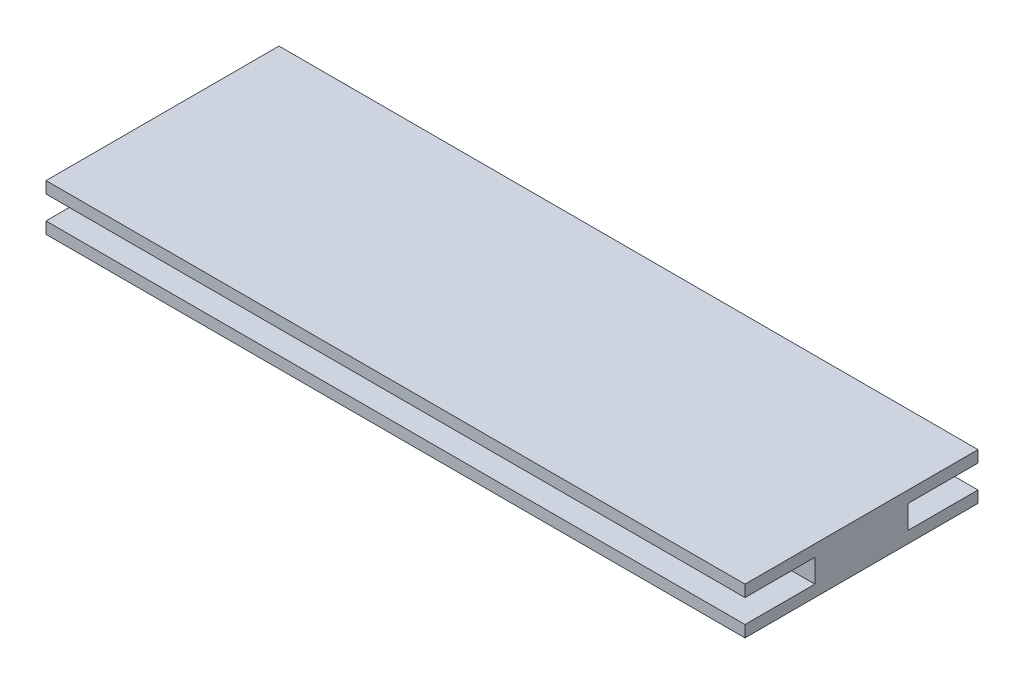
ISO-10303-21;
HEADER;
FILE_DESCRIPTION(('STEP AP214'),'2;1');
FILE_NAME('part.step','',(''),(''),'','','');
FILE_SCHEMA(('AUTOMOTIVE_DESIGN { 1 0 10303 214 1 1 1 1 }'));
ENDSEC;
DATA;
#1=APPLICATION_CONTEXT('core data for automotive mechanical design processes');
#2=APPLICATION_PROTOCOL_DEFINITION('international standard','automotive_design',2000,#1);
#3=PRODUCT_CONTEXT('',#1,'mechanical');
#4=PRODUCT('Part','Part','',(#3));
#5=PRODUCT_RELATED_PRODUCT_CATEGORY('part','',(#4));
#6=PRODUCT_DEFINITION_FORMATION('','',#4);
#7=PRODUCT_DEFINITION_CONTEXT('part definition',#1,'design');
#8=PRODUCT_DEFINITION('design','',#6,#7);
#9=PRODUCT_DEFINITION_SHAPE('','',#8);
#10=(LENGTH_UNIT() NAMED_UNIT(*) SI_UNIT(.MILLI.,.METRE.));
#11=(NAMED_UNIT(*) PLANE_ANGLE_UNIT() SI_UNIT($,.RADIAN.));
#12=(NAMED_UNIT(*) SI_UNIT($,.STERADIAN.) SOLID_ANGLE_UNIT());
#13=UNCERTAINTY_MEASURE_WITH_UNIT(LENGTH_MEASURE(1.E-05),#10,'distance_accuracy_value','');
#14=(GEOMETRIC_REPRESENTATION_CONTEXT(3) GLOBAL_UNCERTAINTY_ASSIGNED_CONTEXT((#13)) GLOBAL_UNIT_ASSIGNED_CONTEXT((#10,
#11,#12)) REPRESENTATION_CONTEXT('',''));
#15=CARTESIAN_POINT('',(0.,0.,0.));
#16=DIRECTION('',(0.,0.,1.));
#17=DIRECTION('',(1.,0.,0.));
#18=AXIS2_PLACEMENT_3D('',#15,#16,#17);
#19=CARTESIAN_POINT('',(95.25,1.5875,-15.875));
#20=DIRECTION('',(0.,0.,1.));
#21=DIRECTION('',(1.,0.,0.));
#22=AXIS2_PLACEMENT_3D('',#19,#20,#21);
#23=PLANE('',#22);
#24=DIRECTION('',(0.,1.,0.));
#25=VECTOR('',#24,1.);
#26=CARTESIAN_POINT('',(0.,1.5875,-15.875));
#27=LINE('',#26,#25);
#28=CARTESIAN_POINT('',(0.,1.5875,-15.875));
#29=VERTEX_POINT('',#28);
#30=CARTESIAN_POINT('',(0.,3.175,-15.875));
#31=VERTEX_POINT('',#30);
#32=EDGE_CURVE('E170',#29,#31,#27,.T.);
#33=ORIENTED_EDGE('',*,*,#32,.T.);
#34=DIRECTION('',(-1.,0.,0.));
#35=VECTOR('',#34,1.);
#36=CARTESIAN_POINT('',(95.25,3.175,-15.875));
#37=LINE('',#36,#35);
#38=CARTESIAN_POINT('',(95.25,3.175,-15.875));
#39=VERTEX_POINT('',#38);
#40=EDGE_CURVE('E11',#39,#31,#37,.T.);
#41=ORIENTED_EDGE('',*,*,#40,.F.);
#42=DIRECTION('',(0.,1.,0.));
#43=VECTOR('',#42,1.);
#44=CARTESIAN_POINT('',(95.25,1.5875,-15.875));
#45=LINE('',#44,#43);
#46=CARTESIAN_POINT('',(95.25,1.5875,-15.875));
#47=VERTEX_POINT('',#46);
#48=EDGE_CURVE('E204',#47,#39,#45,.T.);
#49=ORIENTED_EDGE('',*,*,#48,.F.);
#50=DIRECTION('',(-1.,0.,0.));
#51=VECTOR('',#50,1.);
#52=CARTESIAN_POINT('',(95.25,1.5875,-15.875));
#53=LINE('',#52,#51);
#54=EDGE_CURVE('E166',#47,#29,#53,.T.);
#55=ORIENTED_EDGE('',*,*,#54,.T.);
#56=EDGE_LOOP('',(#33,#41,#49,#55));
#57=FACE_BOUND('',#56,.T.);
#58=ADVANCED_FACE('F45',(#57),#23,.F.);
#59=CARTESIAN_POINT('',(95.25,3.175,15.875));
#60=DIRECTION('',(0.,-1.,0.));
#61=DIRECTION('',(0.,0.,-1.));
#62=AXIS2_PLACEMENT_3D('',#59,#60,#61);
#63=PLANE('',#62);
#64=DIRECTION('',(0.,0.,1.));
#65=VECTOR('',#64,1.);
#66=CARTESIAN_POINT('',(0.,3.175,15.875));
#67=LINE('',#66,#65);
#68=CARTESIAN_POINT('',(0.,3.175,15.875));
#69=VERTEX_POINT('',#68);
#70=EDGE_CURVE('E174',#31,#69,#67,.T.);
#71=ORIENTED_EDGE('',*,*,#70,.T.);
#72=DIRECTION('',(-1.,0.,0.));
#73=VECTOR('',#72,1.);
#74=CARTESIAN_POINT('',(95.25,3.175,15.875));
#75=LINE('',#74,#73);
#76=CARTESIAN_POINT('',(95.25,3.175,15.875));
#77=VERTEX_POINT('',#76);
#78=EDGE_CURVE('E54',#77,#69,#75,.T.);
#79=ORIENTED_EDGE('',*,*,#78,.F.);
#80=DIRECTION('',(0.,0.,1.));
#81=VECTOR('',#80,1.);
#82=CARTESIAN_POINT('',(95.25,3.175,15.875));
#83=LINE('',#82,#81);
#84=EDGE_CURVE('E117',#39,#77,#83,.T.);
#85=ORIENTED_EDGE('',*,*,#84,.F.);
#86=ORIENTED_EDGE('',*,*,#40,.T.);
#87=EDGE_LOOP('',(#71,#79,#85,#86));
#88=FACE_BOUND('',#87,.T.);
#89=ADVANCED_FACE('F298',(#88),#63,.F.);
#90=CARTESIAN_POINT('',(95.25,1.5875,15.875));
#91=DIRECTION('',(0.,0.,-1.));
#92=DIRECTION('',(-1.,0.,0.));
#93=AXIS2_PLACEMENT_3D('',#90,#91,#92);
#94=PLANE('',#93);
#95=DIRECTION('',(0.,-1.,0.));
#96=VECTOR('',#95,1.);
#97=CARTESIAN_POINT('',(0.,1.5875,15.875));
#98=LINE('',#97,#96);
#99=CARTESIAN_POINT('',(0.,1.5875,15.875));
#100=VERTEX_POINT('',#99);
#101=EDGE_CURVE('E177',#69,#100,#98,.T.);
#102=ORIENTED_EDGE('',*,*,#101,.T.);
#103=DIRECTION('',(-1.,0.,0.));
#104=VECTOR('',#103,1.);
#105=CARTESIAN_POINT('',(95.25,1.5875,15.875));
#106=LINE('',#105,#104);
#107=CARTESIAN_POINT('',(95.25,1.5875,15.875));
#108=VERTEX_POINT('',#107);
#109=EDGE_CURVE('E231',#108,#100,#106,.T.);
#110=ORIENTED_EDGE('',*,*,#109,.F.);
#111=DIRECTION('',(0.,-1.,0.));
#112=VECTOR('',#111,1.);
#113=CARTESIAN_POINT('',(95.25,1.5875,15.875));
#114=LINE('',#113,#112);
#115=EDGE_CURVE('E241',#77,#108,#114,.T.);
#116=ORIENTED_EDGE('',*,*,#115,.F.);
#117=ORIENTED_EDGE('',*,*,#78,.T.);
#118=EDGE_LOOP('',(#102,#110,#116,#117));
#119=FACE_BOUND('',#118,.T.);
#120=ADVANCED_FACE('F239',(#119),#94,.F.);
#121=CARTESIAN_POINT('',(95.25,1.5875,6.35));
#122=DIRECTION('',(0.,1.,0.));
#123=DIRECTION('',(0.,0.,1.));
#124=AXIS2_PLACEMENT_3D('',#121,#122,#123);
#125=PLANE('',#124);
#126=DIRECTION('',(0.,0.,-1.));
#127=VECTOR('',#126,1.);
#128=CARTESIAN_POINT('',(0.,1.5875,6.35));
#129=LINE('',#128,#127);
#130=CARTESIAN_POINT('',(0.,1.5875,6.35));
#131=VERTEX_POINT('',#130);
#132=EDGE_CURVE('E180',#100,#131,#129,.T.);
#133=ORIENTED_EDGE('',*,*,#132,.T.);
#134=DIRECTION('',(-1.,0.,0.));
#135=VECTOR('',#134,1.);
#136=CARTESIAN_POINT('',(95.25,1.5875,6.35));
#137=LINE('',#136,#135);
#138=CARTESIAN_POINT('',(95.25,1.5875,6.35));
#139=VERTEX_POINT('',#138);
#140=EDGE_CURVE('E227',#139,#131,#137,.T.);
#141=ORIENTED_EDGE('',*,*,#140,.F.);
#142=DIRECTION('',(0.,0.,-1.));
#143=VECTOR('',#142,1.);
#144=CARTESIAN_POINT('',(95.25,1.5875,6.35));
#145=LINE('',#144,#143);
#146=EDGE_CURVE('E260',#108,#139,#145,.T.);
#147=ORIENTED_EDGE('',*,*,#146,.F.);
#148=ORIENTED_EDGE('',*,*,#109,.T.);
#149=EDGE_LOOP('',(#133,#141,#147,#148));
#150=FACE_BOUND('',#149,.T.);
#151=ADVANCED_FACE('F250',(#150),#125,.F.);
#152=CARTESIAN_POINT('',(95.25,-1.5875,6.35));
#153=DIRECTION('',(0.,0.,-1.));
#154=DIRECTION('',(-1.,0.,0.));
#155=AXIS2_PLACEMENT_3D('',#152,#153,#154);
#156=PLANE('',#155);
#157=DIRECTION('',(0.,-1.,0.));
#158=VECTOR('',#157,1.);
#159=CARTESIAN_POINT('',(0.,-1.5875,6.35));
#160=LINE('',#159,#158);
#161=CARTESIAN_POINT('',(0.,-1.5875,6.35));
#162=VERTEX_POINT('',#161);
#163=EDGE_CURVE('E183',#131,#162,#160,.T.);
#164=ORIENTED_EDGE('',*,*,#163,.T.);
#165=DIRECTION('',(-1.,0.,0.));
#166=VECTOR('',#165,1.);
#167=CARTESIAN_POINT('',(95.25,-1.5875,6.35));
#168=LINE('',#167,#166);
#169=CARTESIAN_POINT('',(95.25,-1.5875,6.35));
#170=VERTEX_POINT('',#169);
#171=EDGE_CURVE('E223',#170,#162,#168,.T.);
#172=ORIENTED_EDGE('',*,*,#171,.F.);
#173=DIRECTION('',(0.,-1.,0.));
#174=VECTOR('',#173,1.);
#175=CARTESIAN_POINT('',(95.25,-1.5875,6.35));
#176=LINE('',#175,#174);
#177=EDGE_CURVE('E256',#139,#170,#176,.T.);
#178=ORIENTED_EDGE('',*,*,#177,.F.);
#179=ORIENTED_EDGE('',*,*,#140,.T.);
#180=EDGE_LOOP('',(#164,#172,#178,#179));
#181=FACE_BOUND('',#180,.T.);
#182=ADVANCED_FACE('F254',(#181),#156,.F.);
#183=CARTESIAN_POINT('',(95.25,-1.5875,6.35));
#184=DIRECTION('',(0.,-1.,0.));
#185=DIRECTION('',(0.,0.,-1.));
#186=AXIS2_PLACEMENT_3D('',#183,#184,#185);
#187=PLANE('',#186);
#188=DIRECTION('',(0.,0.,1.));
#189=VECTOR('',#188,1.);
#190=CARTESIAN_POINT('',(0.,-1.5875,6.35));
#191=LINE('',#190,#189);
#192=CARTESIAN_POINT('',(0.,-1.5875,15.875));
#193=VERTEX_POINT('',#192);
#194=EDGE_CURVE('E186',#162,#193,#191,.T.);
#195=ORIENTED_EDGE('',*,*,#194,.T.);
#196=DIRECTION('',(-1.,0.,0.));
#197=VECTOR('',#196,1.);
#198=CARTESIAN_POINT('',(95.25,-1.5875,15.875));
#199=LINE('',#198,#197);
#200=CARTESIAN_POINT('',(95.25,-1.5875,15.875));
#201=VERTEX_POINT('',#200);
#202=EDGE_CURVE('E219',#201,#193,#199,.T.);
#203=ORIENTED_EDGE('',*,*,#202,.F.);
#204=DIRECTION('',(0.,0.,1.));
#205=VECTOR('',#204,1.);
#206=CARTESIAN_POINT('',(95.25,-1.5875,6.35));
#207=LINE('',#206,#205);
#208=EDGE_CURVE('E259',#170,#201,#207,.T.);
#209=ORIENTED_EDGE('',*,*,#208,.F.);
#210=ORIENTED_EDGE('',*,*,#171,.T.);
#211=EDGE_LOOP('',(#195,#203,#209,#210));
#212=FACE_BOUND('',#211,.T.);
#213=ADVANCED_FACE('F311',(#212),#187,.F.);
#214=CARTESIAN_POINT('',(95.25,-3.175,15.875));
#215=DIRECTION('',(0.,0.,-1.));
#216=DIRECTION('',(-1.,0.,0.));
#217=AXIS2_PLACEMENT_3D('',#214,#215,#216);
#218=PLANE('',#217);
#219=DIRECTION('',(0.,-1.,0.));
#220=VECTOR('',#219,1.);
#221=CARTESIAN_POINT('',(0.,-3.175,15.875));
#222=LINE('',#221,#220);
#223=CARTESIAN_POINT('',(0.,-3.175,15.875));
#224=VERTEX_POINT('',#223);
#225=EDGE_CURVE('E189',#193,#224,#222,.T.);
#226=ORIENTED_EDGE('',*,*,#225,.T.);
#227=DIRECTION('',(-1.,0.,0.));
#228=VECTOR('',#227,1.);
#229=CARTESIAN_POINT('',(95.25,-3.175,15.875));
#230=LINE('',#229,#228);
#231=CARTESIAN_POINT('',(95.25,-3.175,15.875));
#232=VERTEX_POINT('',#231);
#233=EDGE_CURVE('E215',#232,#224,#230,.T.);
#234=ORIENTED_EDGE('',*,*,#233,.F.);
#235=DIRECTION('',(0.,-1.,0.));
#236=VECTOR('',#235,1.);
#237=CARTESIAN_POINT('',(95.25,-3.175,15.875));
#238=LINE('',#237,#236);
#239=EDGE_CURVE('E264',#201,#232,#238,.T.);
#240=ORIENTED_EDGE('',*,*,#239,.F.);
#241=ORIENTED_EDGE('',*,*,#202,.T.);
#242=EDGE_LOOP('',(#226,#234,#240,#241));
#243=FACE_BOUND('',#242,.T.);
#244=ADVANCED_FACE('F314',(#243),#218,.F.);
#245=CARTESIAN_POINT('',(95.25,-3.175,15.875));
#246=DIRECTION('',(0.,1.,0.));
#247=DIRECTION('',(0.,0.,1.));
#248=AXIS2_PLACEMENT_3D('',#245,#246,#247);
#249=PLANE('',#248);
#250=DIRECTION('',(0.,0.,-1.));
#251=VECTOR('',#250,1.);
#252=CARTESIAN_POINT('',(0.,-3.175,15.875));
#253=LINE('',#252,#251);
#254=CARTESIAN_POINT('',(0.,-3.175,-15.875));
#255=VERTEX_POINT('',#254);
#256=EDGE_CURVE('E192',#224,#255,#253,.T.);
#257=ORIENTED_EDGE('',*,*,#256,.T.);
#258=DIRECTION('',(-1.,0.,0.));
#259=VECTOR('',#258,1.);
#260=CARTESIAN_POINT('',(95.25,-3.175,-15.875));
#261=LINE('',#260,#259);
#262=CARTESIAN_POINT('',(95.25,-3.175,-15.875));
#263=VERTEX_POINT('',#262);
#264=EDGE_CURVE('E211',#263,#255,#261,.T.);
#265=ORIENTED_EDGE('',*,*,#264,.F.);
#266=DIRECTION('',(0.,0.,-1.));
#267=VECTOR('',#266,1.);
#268=CARTESIAN_POINT('',(95.25,-3.175,15.875));
#269=LINE('',#268,#267);
#270=EDGE_CURVE('E271',#232,#263,#269,.T.);
#271=ORIENTED_EDGE('',*,*,#270,.F.);
#272=ORIENTED_EDGE('',*,*,#233,.T.);
#273=EDGE_LOOP('',(#257,#265,#271,#272));
#274=FACE_BOUND('',#273,.T.);
#275=ADVANCED_FACE('F279',(#274),#249,.F.);
#276=CARTESIAN_POINT('',(95.25,-3.175,-15.875));
#277=DIRECTION('',(0.,0.,1.));
#278=DIRECTION('',(1.,0.,0.));
#279=AXIS2_PLACEMENT_3D('',#276,#277,#278);
#280=PLANE('',#279);
#281=DIRECTION('',(0.,1.,0.));
#282=VECTOR('',#281,1.);
#283=CARTESIAN_POINT('',(0.,-3.175,-15.875));
#284=LINE('',#283,#282);
#285=CARTESIAN_POINT('',(0.,-1.5875,-15.875));
#286=VERTEX_POINT('',#285);
#287=EDGE_CURVE('E195',#255,#286,#284,.T.);
#288=ORIENTED_EDGE('',*,*,#287,.T.);
#289=DIRECTION('',(-1.,0.,0.));
#290=VECTOR('',#289,1.);
#291=CARTESIAN_POINT('',(95.25,-1.5875,-15.875));
#292=LINE('',#291,#290);
#293=CARTESIAN_POINT('',(95.25,-1.5875,-15.875));
#294=VERTEX_POINT('',#293);
#295=EDGE_CURVE('E159',#294,#286,#292,.T.);
#296=ORIENTED_EDGE('',*,*,#295,.F.);
#297=DIRECTION('',(0.,1.,0.));
#298=VECTOR('',#297,1.);
#299=CARTESIAN_POINT('',(95.25,-3.175,-15.875));
#300=LINE('',#299,#298);
#301=EDGE_CURVE('E148',#263,#294,#300,.T.);
#302=ORIENTED_EDGE('',*,*,#301,.F.);
#303=ORIENTED_EDGE('',*,*,#264,.T.);
#304=EDGE_LOOP('',(#288,#296,#302,#303));
#305=FACE_BOUND('',#304,.T.);
#306=ADVANCED_FACE('F283',(#305),#280,.F.);
#307=CARTESIAN_POINT('',(95.25,-1.5875,-6.35));
#308=DIRECTION('',(0.,-1.,0.));
#309=DIRECTION('',(0.,0.,-1.));
#310=AXIS2_PLACEMENT_3D('',#307,#308,#309);
#311=PLANE('',#310);
#312=DIRECTION('',(0.,0.,1.));
#313=VECTOR('',#312,1.);
#314=CARTESIAN_POINT('',(0.,-1.5875,-6.35));
#315=LINE('',#314,#313);
#316=CARTESIAN_POINT('',(0.,-1.5875,-6.35));
#317=VERTEX_POINT('',#316);
#318=EDGE_CURVE('E157',#286,#317,#315,.T.);
#319=ORIENTED_EDGE('',*,*,#318,.T.);
#320=DIRECTION('',(-1.,0.,0.));
#321=VECTOR('',#320,1.);
#322=CARTESIAN_POINT('',(95.25,-1.5875,-6.35));
#323=LINE('',#322,#321);
#324=CARTESIAN_POINT('',(95.25,-1.5875,-6.35));
#325=VERTEX_POINT('',#324);
#326=EDGE_CURVE('E154',#325,#317,#323,.T.);
#327=ORIENTED_EDGE('',*,*,#326,.F.);
#328=DIRECTION('',(0.,0.,1.));
#329=VECTOR('',#328,1.);
#330=CARTESIAN_POINT('',(95.25,-1.5875,-6.35));
#331=LINE('',#330,#329);
#332=EDGE_CURVE('E142',#294,#325,#331,.T.);
#333=ORIENTED_EDGE('',*,*,#332,.F.);
#334=ORIENTED_EDGE('',*,*,#295,.T.);
#335=EDGE_LOOP('',(#319,#327,#333,#334));
#336=FACE_BOUND('',#335,.T.);
#337=ADVANCED_FACE('F155',(#336),#311,.F.);
#338=CARTESIAN_POINT('',(95.25,-1.5875,-6.35));
#339=DIRECTION('',(0.,0.,1.));
#340=DIRECTION('',(1.,0.,0.));
#341=AXIS2_PLACEMENT_3D('',#338,#339,#340);
#342=PLANE('',#341);
#343=DIRECTION('',(0.,1.,0.));
#344=VECTOR('',#343,1.);
#345=CARTESIAN_POINT('',(0.,-1.5875,-6.35));
#346=LINE('',#345,#344);
#347=CARTESIAN_POINT('',(0.,1.5875,-6.35));
#348=VERTEX_POINT('',#347);
#349=EDGE_CURVE('E103',#317,#348,#346,.T.);
#350=ORIENTED_EDGE('',*,*,#349,.T.);
#351=DIRECTION('',(-1.,0.,0.));
#352=VECTOR('',#351,1.);
#353=CARTESIAN_POINT('',(95.25,1.5875,-6.35));
#354=LINE('',#353,#352);
#355=CARTESIAN_POINT('',(95.25,1.5875,-6.35));
#356=VERTEX_POINT('',#355);
#357=EDGE_CURVE('E160',#356,#348,#354,.T.);
#358=ORIENTED_EDGE('',*,*,#357,.F.);
#359=DIRECTION('',(0.,1.,0.));
#360=VECTOR('',#359,1.);
#361=CARTESIAN_POINT('',(95.25,-1.5875,-6.35));
#362=LINE('',#361,#360);
#363=EDGE_CURVE('E146',#325,#356,#362,.T.);
#364=ORIENTED_EDGE('',*,*,#363,.F.);
#365=ORIENTED_EDGE('',*,*,#326,.T.);
#366=EDGE_LOOP('',(#350,#358,#364,#365));
#367=FACE_BOUND('',#366,.T.);
#368=ADVANCED_FACE('F162',(#367),#342,.F.);
#369=CARTESIAN_POINT('',(95.25,1.5875,-6.35));
#370=DIRECTION('',(0.,1.,0.));
#371=DIRECTION('',(0.,0.,1.));
#372=AXIS2_PLACEMENT_3D('',#369,#370,#371);
#373=PLANE('',#372);
#374=DIRECTION('',(0.,0.,-1.));
#375=VECTOR('',#374,1.);
#376=CARTESIAN_POINT('',(0.,1.5875,-6.35));
#377=LINE('',#376,#375);
#378=EDGE_CURVE('E109',#348,#29,#377,.T.);
#379=ORIENTED_EDGE('',*,*,#378,.T.);
#380=ORIENTED_EDGE('',*,*,#54,.F.);
#381=DIRECTION('',(0.,0.,-1.));
#382=VECTOR('',#381,1.);
#383=CARTESIAN_POINT('',(95.25,1.5875,-6.35));
#384=LINE('',#383,#382);
#385=EDGE_CURVE('E62',#356,#47,#384,.T.);
#386=ORIENTED_EDGE('',*,*,#385,.F.);
#387=ORIENTED_EDGE('',*,*,#357,.T.);
#388=EDGE_LOOP('',(#379,#380,#386,#387));
#389=FACE_BOUND('',#388,.T.);
#390=ADVANCED_FACE('F287',(#389),#373,.F.);
#391=CARTESIAN_POINT('',(95.25,0.,0.));
#392=DIRECTION('',(-1.,0.,0.));
#393=DIRECTION('',(0.,0.,1.));
#394=AXIS2_PLACEMENT_3D('',#391,#392,#393);
#395=PLANE('',#394);
#396=ORIENTED_EDGE('',*,*,#48,.T.);
#397=ORIENTED_EDGE('',*,*,#84,.T.);
#398=ORIENTED_EDGE('',*,*,#115,.T.);
#399=ORIENTED_EDGE('',*,*,#146,.T.);
#400=ORIENTED_EDGE('',*,*,#177,.T.);
#401=ORIENTED_EDGE('',*,*,#208,.T.);
#402=ORIENTED_EDGE('',*,*,#239,.T.);
#403=ORIENTED_EDGE('',*,*,#270,.T.);
#404=ORIENTED_EDGE('',*,*,#301,.T.);
#405=ORIENTED_EDGE('',*,*,#332,.T.);
#406=ORIENTED_EDGE('',*,*,#363,.T.);
#407=ORIENTED_EDGE('',*,*,#385,.T.);
#408=EDGE_LOOP('',(#396,#397,#398,#399,#400,#401,#402,#403,#404,#405,#406,#407));
#409=FACE_BOUND('',#408,.T.);
#410=ADVANCED_FACE('F144',(#409),#395,.F.);
#411=CARTESIAN_POINT('',(0.,0.,0.));
#412=DIRECTION('',(-1.,0.,0.));
#413=DIRECTION('',(0.,0.,1.));
#414=AXIS2_PLACEMENT_3D('',#411,#412,#413);
#415=PLANE('',#414);
#416=ORIENTED_EDGE('',*,*,#32,.F.);
#417=ORIENTED_EDGE('',*,*,#378,.F.);
#418=ORIENTED_EDGE('',*,*,#349,.F.);
#419=ORIENTED_EDGE('',*,*,#318,.F.);
#420=ORIENTED_EDGE('',*,*,#287,.F.);
#421=ORIENTED_EDGE('',*,*,#256,.F.);
#422=ORIENTED_EDGE('',*,*,#225,.F.);
#423=ORIENTED_EDGE('',*,*,#194,.F.);
#424=ORIENTED_EDGE('',*,*,#163,.F.);
#425=ORIENTED_EDGE('',*,*,#132,.F.);
#426=ORIENTED_EDGE('',*,*,#101,.F.);
#427=ORIENTED_EDGE('',*,*,#70,.F.);
#428=EDGE_LOOP('',(#416,#417,#418,#419,#420,#421,#422,#423,#424,#425,#426,#427));
#429=FACE_BOUND('',#428,.T.);
#430=ADVANCED_FACE('F245',(#429),#415,.T.);
#431=CLOSED_SHELL('',(#58,#89,#120,#151,#182,#213,#244,#275,#306,#337,#368,#390,#410,#430));
#432=MANIFOLD_SOLID_BREP('B2',#431);
#433=ADVANCED_BREP_SHAPE_REPRESENTATION('',(#18,#432),#14);
#434=SHAPE_DEFINITION_REPRESENTATION(#9,#433);
ENDSEC;
END-ISO-10303-21;
